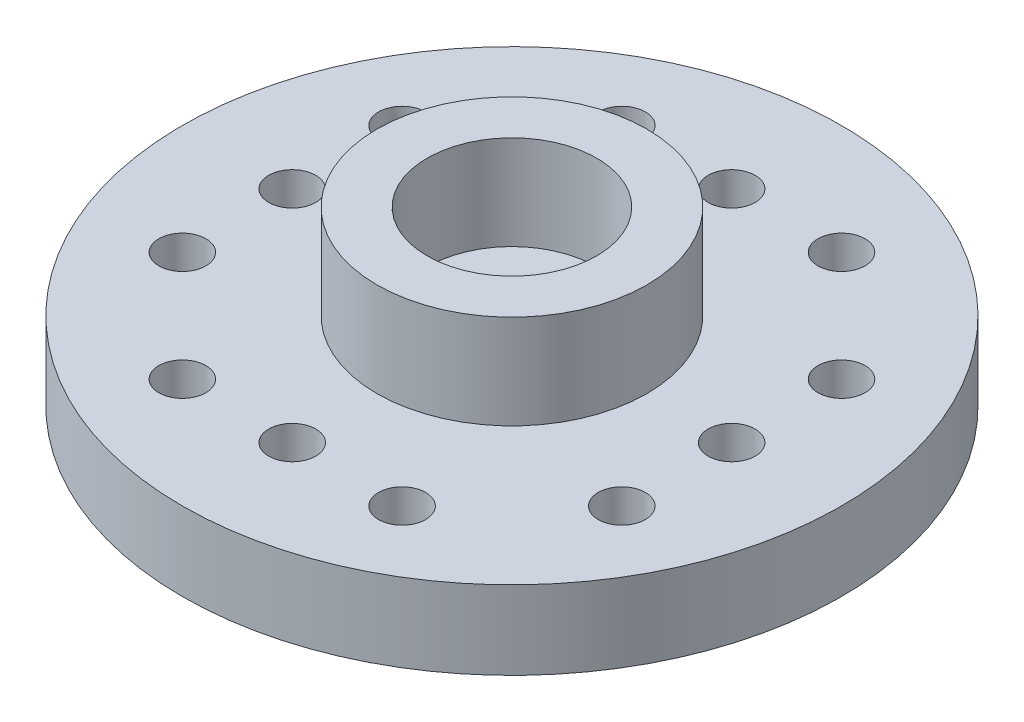
ISO-10303-21;
HEADER;
FILE_DESCRIPTION(('STEP AP214'),'2;1');
FILE_NAME('part.step','',(''),(''),'','','');
FILE_SCHEMA(('AUTOMOTIVE_DESIGN { 1 0 10303 214 1 1 1 1 }'));
ENDSEC;
DATA;
#1=APPLICATION_CONTEXT('core data for automotive mechanical design processes');
#2=APPLICATION_PROTOCOL_DEFINITION('international standard','automotive_design',2000,#1);
#3=PRODUCT_CONTEXT('',#1,'mechanical');
#4=PRODUCT('Part','Part','',(#3));
#5=PRODUCT_RELATED_PRODUCT_CATEGORY('part','',(#4));
#6=PRODUCT_DEFINITION_FORMATION('','',#4);
#7=PRODUCT_DEFINITION_CONTEXT('part definition',#1,'design');
#8=PRODUCT_DEFINITION('design','',#6,#7);
#9=PRODUCT_DEFINITION_SHAPE('','',#8);
#10=(LENGTH_UNIT() NAMED_UNIT(*) SI_UNIT(.MILLI.,.METRE.));
#11=(NAMED_UNIT(*) PLANE_ANGLE_UNIT() SI_UNIT($,.RADIAN.));
#12=(NAMED_UNIT(*) SI_UNIT($,.STERADIAN.) SOLID_ANGLE_UNIT());
#13=UNCERTAINTY_MEASURE_WITH_UNIT(LENGTH_MEASURE(1.E-05),#10,'distance_accuracy_value','');
#14=(GEOMETRIC_REPRESENTATION_CONTEXT(3) GLOBAL_UNCERTAINTY_ASSIGNED_CONTEXT((#13)) GLOBAL_UNIT_ASSIGNED_CONTEXT((#10,
#11,#12)) REPRESENTATION_CONTEXT('',''));
#15=CARTESIAN_POINT('',(0.,0.,0.));
#16=DIRECTION('',(0.,0.,1.));
#17=DIRECTION('',(1.,0.,0.));
#18=AXIS2_PLACEMENT_3D('',#15,#16,#17);
#19=CARTESIAN_POINT('',(0.,2.5,0.));
#20=DIRECTION('',(0.,-1.,0.));
#21=DIRECTION('',(0.,0.,-1.));
#22=AXIS2_PLACEMENT_3D('',#19,#20,#21);
#23=CYLINDRICAL_SURFACE('',#22,1.5);
#24=CARTESIAN_POINT('',(0.,2.5,0.));
#25=DIRECTION('',(0.,1.,0.));
#26=DIRECTION('',(0.,0.,1.));
#27=AXIS2_PLACEMENT_3D('',#24,#25,#26);
#28=CIRCLE('',#27,1.5);
#29=CARTESIAN_POINT('',(0.,2.5,1.5));
#30=VERTEX_POINT('',#29);
#31=EDGE_CURVE('E59',#30,#30,#28,.T.);
#32=ORIENTED_EDGE('',*,*,#31,.T.);
#33=EDGE_LOOP('',(#32));
#34=FACE_BOUND('',#33,.T.);
#35=CARTESIAN_POINT('',(0.,1.,0.));
#36=DIRECTION('',(0.,-1.,0.));
#37=DIRECTION('',(0.,0.,-1.));
#38=AXIS2_PLACEMENT_3D('',#35,#36,#37);
#39=CIRCLE('',#38,1.5);
#40=CARTESIAN_POINT('',(0.,1.,-1.5));
#41=VERTEX_POINT('',#40);
#42=EDGE_CURVE('E148',#41,#41,#39,.F.);
#43=ORIENTED_EDGE('',*,*,#42,.F.);
#44=EDGE_LOOP('',(#43));
#45=FACE_BOUND('',#44,.T.);
#46=ADVANCED_FACE('F43',(#34,#45),#23,.F.);
#47=CARTESIAN_POINT('',(0.,2.5,0.));
#48=DIRECTION('',(0.,1.,0.));
#49=DIRECTION('',(0.,0.,1.));
#50=AXIS2_PLACEMENT_3D('',#47,#48,#49);
#51=PLANE('',#50);
#52=ORIENTED_EDGE('',*,*,#31,.F.);
#53=EDGE_LOOP('',(#52));
#54=FACE_BOUND('',#53,.T.);
#55=CARTESIAN_POINT('',(0.,2.5,0.));
#56=DIRECTION('',(0.,1.,0.));
#57=DIRECTION('',(0.,0.,1.));
#58=AXIS2_PLACEMENT_3D('',#55,#56,#57);
#59=CIRCLE('',#58,2.7);
#60=CARTESIAN_POINT('',(0.,2.5,2.7));
#61=VERTEX_POINT('',#60);
#62=EDGE_CURVE('E11',#61,#61,#59,.F.);
#63=ORIENTED_EDGE('',*,*,#62,.F.);
#64=EDGE_LOOP('',(#63));
#65=FACE_BOUND('',#64,.T.);
#66=ADVANCED_FACE('F223',(#54,#65),#51,.T.);
#67=CARTESIAN_POINT('',(6.99999999999999,2.5,3.50000000000002));
#68=DIRECTION('',(0.,1.,0.));
#69=DIRECTION('',(-1.,0.,0.));
#70=AXIS2_PLACEMENT_3D('',#67,#68,#69);
#71=CIRCLE('',#70,0.749999999999999);
#72=CARTESIAN_POINT('',(6.24999999999999,2.5,3.50000000000002));
#73=VERTEX_POINT('',#72);
#74=EDGE_CURVE('E116',#73,#73,#71,.T.);
#75=ORIENTED_EDGE('',*,*,#74,.F.);
#76=EDGE_LOOP('',(#75));
#77=FACE_BOUND('',#76,.T.);
#78=CARTESIAN_POINT('',(7.00000000000001,2.5,-3.49999999999998));
#79=DIRECTION('',(0.,1.,0.));
#80=DIRECTION('',(-1.,0.,0.));
#81=AXIS2_PLACEMENT_3D('',#78,#79,#80);
#82=CIRCLE('',#81,0.75);
#83=CARTESIAN_POINT('',(6.25000000000001,2.5,-3.49999999999998));
#84=VERTEX_POINT('',#83);
#85=EDGE_CURVE('E110',#84,#84,#82,.T.);
#86=ORIENTED_EDGE('',*,*,#85,.F.);
#87=EDGE_LOOP('',(#86));
#88=FACE_BOUND('',#87,.T.);
#89=CARTESIAN_POINT('',(0.,2.5,7.));
#90=DIRECTION('',(0.,1.,0.));
#91=DIRECTION('',(0.,0.,-1.));
#92=AXIS2_PLACEMENT_3D('',#89,#90,#91);
#93=CIRCLE('',#92,0.75);
#94=CARTESIAN_POINT('',(0.,2.5,6.25));
#95=VERTEX_POINT('',#94);
#96=EDGE_CURVE('E104',#95,#95,#93,.T.);
#97=ORIENTED_EDGE('',*,*,#96,.F.);
#98=EDGE_LOOP('',(#97));
#99=FACE_BOUND('',#98,.T.);
#100=CARTESIAN_POINT('',(-3.5,2.5,7.));
#101=DIRECTION('',(0.,1.,0.));
#102=DIRECTION('',(0.,0.,-1.));
#103=AXIS2_PLACEMENT_3D('',#100,#101,#102);
#104=CIRCLE('',#103,0.749999999999999);
#105=CARTESIAN_POINT('',(-3.5,2.5,6.25));
#106=VERTEX_POINT('',#105);
#107=EDGE_CURVE('E97',#106,#106,#104,.T.);
#108=ORIENTED_EDGE('',*,*,#107,.F.);
#109=EDGE_LOOP('',(#108));
#110=FACE_BOUND('',#109,.T.);
#111=CARTESIAN_POINT('',(-7.00000000000004,2.5,3.49999999999993));
#112=DIRECTION('',(0.,1.,0.));
#113=DIRECTION('',(1.,0.,0.));
#114=AXIS2_PLACEMENT_3D('',#111,#112,#113);
#115=CIRCLE('',#114,0.75);
#116=CARTESIAN_POINT('',(-6.25000000000004,2.5,3.49999999999993));
#117=VERTEX_POINT('',#116);
#118=EDGE_CURVE('E133',#117,#117,#115,.T.);
#119=ORIENTED_EDGE('',*,*,#118,.F.);
#120=EDGE_LOOP('',(#119));
#121=FACE_BOUND('',#120,.T.);
#122=CARTESIAN_POINT('',(-6.99999999999996,2.5,-3.50000000000007));
#123=DIRECTION('',(0.,1.,0.));
#124=DIRECTION('',(1.,0.,0.));
#125=AXIS2_PLACEMENT_3D('',#122,#123,#124);
#126=CIRCLE('',#125,0.749999999999999);
#127=CARTESIAN_POINT('',(-6.24999999999996,2.5,-3.50000000000007));
#128=VERTEX_POINT('',#127);
#129=EDGE_CURVE('E140',#128,#128,#126,.T.);
#130=ORIENTED_EDGE('',*,*,#129,.F.);
#131=EDGE_LOOP('',(#130));
#132=FACE_BOUND('',#131,.T.);
#133=CARTESIAN_POINT('',(-7.,2.5,0.));
#134=DIRECTION('',(0.,1.,0.));
#135=DIRECTION('',(1.,0.,0.));
#136=AXIS2_PLACEMENT_3D('',#133,#134,#135);
#137=CIRCLE('',#136,0.75);
#138=CARTESIAN_POINT('',(-6.25,2.5,0.));
#139=VERTEX_POINT('',#138);
#140=EDGE_CURVE('E121',#139,#139,#137,.T.);
#141=ORIENTED_EDGE('',*,*,#140,.F.);
#142=EDGE_LOOP('',(#141));
#143=FACE_BOUND('',#142,.T.);
#144=CARTESIAN_POINT('',(3.5,2.5,7.));
#145=DIRECTION('',(0.,1.,0.));
#146=DIRECTION('',(0.,0.,-1.));
#147=AXIS2_PLACEMENT_3D('',#144,#145,#146);
#148=CIRCLE('',#147,0.75);
#149=CARTESIAN_POINT('',(3.5,2.5,6.25));
#150=VERTEX_POINT('',#149);
#151=EDGE_CURVE('E128',#150,#150,#148,.T.);
#152=ORIENTED_EDGE('',*,*,#151,.F.);
#153=EDGE_LOOP('',(#152));
#154=FACE_BOUND('',#153,.T.);
#155=CARTESIAN_POINT('',(7.,2.5,0.));
#156=DIRECTION('',(0.,1.,0.));
#157=DIRECTION('',(-1.,0.,0.));
#158=AXIS2_PLACEMENT_3D('',#155,#156,#157);
#159=CIRCLE('',#158,0.75);
#160=CARTESIAN_POINT('',(6.25,2.5,0.));
#161=VERTEX_POINT('',#160);
#162=EDGE_CURVE('E91',#161,#161,#159,.T.);
#163=ORIENTED_EDGE('',*,*,#162,.F.);
#164=EDGE_LOOP('',(#163));
#165=FACE_BOUND('',#164,.T.);
#166=CARTESIAN_POINT('',(-3.5,2.5,-7.));
#167=DIRECTION('',(0.,1.,0.));
#168=DIRECTION('',(0.,0.,1.));
#169=AXIS2_PLACEMENT_3D('',#166,#167,#168);
#170=CIRCLE('',#169,0.75);
#171=CARTESIAN_POINT('',(-3.5,2.5,-6.25));
#172=VERTEX_POINT('',#171);
#173=EDGE_CURVE('E82',#172,#172,#170,.T.);
#174=ORIENTED_EDGE('',*,*,#173,.F.);
#175=EDGE_LOOP('',(#174));
#176=FACE_BOUND('',#175,.T.);
#177=CARTESIAN_POINT('',(3.5,2.5,-7.));
#178=DIRECTION('',(0.,1.,0.));
#179=DIRECTION('',(0.,0.,1.));
#180=AXIS2_PLACEMENT_3D('',#177,#178,#179);
#181=CIRCLE('',#180,0.749999999999999);
#182=CARTESIAN_POINT('',(3.5,2.5,-6.25));
#183=VERTEX_POINT('',#182);
#184=EDGE_CURVE('E76',#183,#183,#181,.T.);
#185=ORIENTED_EDGE('',*,*,#184,.F.);
#186=EDGE_LOOP('',(#185));
#187=FACE_BOUND('',#186,.T.);
#188=CARTESIAN_POINT('',(0.,2.5,-7.));
#189=DIRECTION('',(0.,1.,0.));
#190=DIRECTION('',(0.,0.,1.));
#191=AXIS2_PLACEMENT_3D('',#188,#189,#190);
#192=CIRCLE('',#191,0.75);
#193=CARTESIAN_POINT('',(0.,2.5,-6.25));
#194=VERTEX_POINT('',#193);
#195=EDGE_CURVE('E73',#194,#194,#192,.T.);
#196=ORIENTED_EDGE('',*,*,#195,.F.);
#197=EDGE_LOOP('',(#196));
#198=FACE_BOUND('',#197,.T.);
#199=CARTESIAN_POINT('',(0.,2.5,0.));
#200=DIRECTION('',(0.,1.,0.));
#201=DIRECTION('',(0.,0.,1.));
#202=AXIS2_PLACEMENT_3D('',#199,#200,#201);
#203=CIRCLE('',#202,4.3);
#204=CARTESIAN_POINT('',(0.,2.5,4.3));
#205=VERTEX_POINT('',#204);
#206=EDGE_CURVE('E64',#205,#205,#203,.T.);
#207=ORIENTED_EDGE('',*,*,#206,.F.);
#208=EDGE_LOOP('',(#207));
#209=FACE_BOUND('',#208,.T.);
#210=CARTESIAN_POINT('',(0.,2.5,0.));
#211=DIRECTION('',(0.,1.,0.));
#212=DIRECTION('',(0.,0.,1.));
#213=AXIS2_PLACEMENT_3D('',#210,#211,#212);
#214=CIRCLE('',#213,10.5);
#215=CARTESIAN_POINT('',(0.,2.5,10.5));
#216=VERTEX_POINT('',#215);
#217=EDGE_CURVE('E50',#216,#216,#214,.T.);
#218=ORIENTED_EDGE('',*,*,#217,.T.);
#219=EDGE_LOOP('',(#218));
#220=FACE_BOUND('',#219,.T.);
#221=ADVANCED_FACE('F184',(#77,#88,#99,#110,#121,#132,#143,#154,#165,#176,#187,#198,#209,#220),
#51,.T.);
#222=CARTESIAN_POINT('',(0.,0.,0.));
#223=DIRECTION('',(0.,1.,0.));
#224=DIRECTION('',(0.,0.,1.));
#225=AXIS2_PLACEMENT_3D('',#222,#223,#224);
#226=PLANE('',#225);
#227=CARTESIAN_POINT('',(0.,0.,0.));
#228=DIRECTION('',(0.,-1.,0.));
#229=DIRECTION('',(0.,0.,-1.));
#230=AXIS2_PLACEMENT_3D('',#227,#228,#229);
#231=CIRCLE('',#230,4.3);
#232=CARTESIAN_POINT('',(0.,0.,-4.3));
#233=VERTEX_POINT('',#232);
#234=EDGE_CURVE('E154',#233,#233,#231,.T.);
#235=ORIENTED_EDGE('',*,*,#234,.F.);
#236=EDGE_LOOP('',(#235));
#237=FACE_BOUND('',#236,.T.);
#238=CARTESIAN_POINT('',(6.99999999999999,0.,3.50000000000002));
#239=DIRECTION('',(0.,1.,0.));
#240=DIRECTION('',(-1.,0.,0.));
#241=AXIS2_PLACEMENT_3D('',#238,#239,#240);
#242=CIRCLE('',#241,0.749999999999999);
#243=CARTESIAN_POINT('',(6.24999999999999,0.,3.50000000000002));
#244=VERTEX_POINT('',#243);
#245=EDGE_CURVE('E94',#244,#244,#242,.T.);
#246=ORIENTED_EDGE('',*,*,#245,.T.);
#247=EDGE_LOOP('',(#246));
#248=FACE_BOUND('',#247,.T.);
#249=CARTESIAN_POINT('',(7.00000000000001,0.,-3.49999999999998));
#250=DIRECTION('',(0.,1.,0.));
#251=DIRECTION('',(-1.,0.,0.));
#252=AXIS2_PLACEMENT_3D('',#249,#250,#251);
#253=CIRCLE('',#252,0.75);
#254=CARTESIAN_POINT('',(6.25000000000001,0.,-3.49999999999998));
#255=VERTEX_POINT('',#254);
#256=EDGE_CURVE('E113',#255,#255,#253,.T.);
#257=ORIENTED_EDGE('',*,*,#256,.T.);
#258=EDGE_LOOP('',(#257));
#259=FACE_BOUND('',#258,.T.);
#260=CARTESIAN_POINT('',(0.,0.,7.));
#261=DIRECTION('',(0.,1.,0.));
#262=DIRECTION('',(0.,0.,-1.));
#263=AXIS2_PLACEMENT_3D('',#260,#261,#262);
#264=CIRCLE('',#263,0.75);
#265=CARTESIAN_POINT('',(0.,0.,6.25));
#266=VERTEX_POINT('',#265);
#267=EDGE_CURVE('E107',#266,#266,#264,.T.);
#268=ORIENTED_EDGE('',*,*,#267,.T.);
#269=EDGE_LOOP('',(#268));
#270=FACE_BOUND('',#269,.T.);
#271=CARTESIAN_POINT('',(-3.5,0.,7.));
#272=DIRECTION('',(0.,1.,0.));
#273=DIRECTION('',(0.,0.,-1.));
#274=AXIS2_PLACEMENT_3D('',#271,#272,#273);
#275=CIRCLE('',#274,0.749999999999999);
#276=CARTESIAN_POINT('',(-3.5,0.,6.25));
#277=VERTEX_POINT('',#276);
#278=EDGE_CURVE('E100',#277,#277,#275,.T.);
#279=ORIENTED_EDGE('',*,*,#278,.T.);
#280=EDGE_LOOP('',(#279));
#281=FACE_BOUND('',#280,.T.);
#282=CARTESIAN_POINT('',(-7.00000000000004,0.,3.49999999999993));
#283=DIRECTION('',(0.,1.,0.));
#284=DIRECTION('',(1.,0.,0.));
#285=AXIS2_PLACEMENT_3D('',#282,#283,#284);
#286=CIRCLE('',#285,0.75);
#287=CARTESIAN_POINT('',(-6.25000000000004,0.,3.49999999999993));
#288=VERTEX_POINT('',#287);
#289=EDGE_CURVE('E136',#288,#288,#286,.T.);
#290=ORIENTED_EDGE('',*,*,#289,.T.);
#291=EDGE_LOOP('',(#290));
#292=FACE_BOUND('',#291,.T.);
#293=CARTESIAN_POINT('',(-6.99999999999996,0.,-3.50000000000007));
#294=DIRECTION('',(0.,1.,0.));
#295=DIRECTION('',(1.,0.,0.));
#296=AXIS2_PLACEMENT_3D('',#293,#294,#295);
#297=CIRCLE('',#296,0.749999999999999);
#298=CARTESIAN_POINT('',(-6.24999999999996,0.,-3.50000000000007));
#299=VERTEX_POINT('',#298);
#300=EDGE_CURVE('E125',#299,#299,#297,.T.);
#301=ORIENTED_EDGE('',*,*,#300,.T.);
#302=EDGE_LOOP('',(#301));
#303=FACE_BOUND('',#302,.T.);
#304=CARTESIAN_POINT('',(-7.,0.,0.));
#305=DIRECTION('',(0.,1.,0.));
#306=DIRECTION('',(1.,0.,0.));
#307=AXIS2_PLACEMENT_3D('',#304,#305,#306);
#308=CIRCLE('',#307,0.75);
#309=CARTESIAN_POINT('',(-6.25,0.,0.));
#310=VERTEX_POINT('',#309);
#311=EDGE_CURVE('E124',#310,#310,#308,.T.);
#312=ORIENTED_EDGE('',*,*,#311,.T.);
#313=EDGE_LOOP('',(#312));
#314=FACE_BOUND('',#313,.T.);
#315=CARTESIAN_POINT('',(3.5,0.,7.));
#316=DIRECTION('',(0.,1.,0.));
#317=DIRECTION('',(0.,0.,-1.));
#318=AXIS2_PLACEMENT_3D('',#315,#316,#317);
#319=CIRCLE('',#318,0.75);
#320=CARTESIAN_POINT('',(3.5,0.,6.25));
#321=VERTEX_POINT('',#320);
#322=EDGE_CURVE('E101',#321,#321,#319,.T.);
#323=ORIENTED_EDGE('',*,*,#322,.T.);
#324=EDGE_LOOP('',(#323));
#325=FACE_BOUND('',#324,.T.);
#326=CARTESIAN_POINT('',(7.,0.,0.));
#327=DIRECTION('',(0.,1.,0.));
#328=DIRECTION('',(-1.,0.,0.));
#329=AXIS2_PLACEMENT_3D('',#326,#327,#328);
#330=CIRCLE('',#329,0.75);
#331=CARTESIAN_POINT('',(6.25,0.,0.));
#332=VERTEX_POINT('',#331);
#333=EDGE_CURVE('E83',#332,#332,#330,.T.);
#334=ORIENTED_EDGE('',*,*,#333,.T.);
#335=EDGE_LOOP('',(#334));
#336=FACE_BOUND('',#335,.T.);
#337=CARTESIAN_POINT('',(-3.5,0.,-7.));
#338=DIRECTION('',(0.,1.,0.));
#339=DIRECTION('',(0.,0.,1.));
#340=AXIS2_PLACEMENT_3D('',#337,#338,#339);
#341=CIRCLE('',#340,0.75);
#342=CARTESIAN_POINT('',(-3.5,0.,-6.25));
#343=VERTEX_POINT('',#342);
#344=EDGE_CURVE('E79',#343,#343,#341,.T.);
#345=ORIENTED_EDGE('',*,*,#344,.T.);
#346=EDGE_LOOP('',(#345));
#347=FACE_BOUND('',#346,.T.);
#348=CARTESIAN_POINT('',(3.5,0.,-7.));
#349=DIRECTION('',(0.,1.,0.));
#350=DIRECTION('',(0.,0.,1.));
#351=AXIS2_PLACEMENT_3D('',#348,#349,#350);
#352=CIRCLE('',#351,0.749999999999999);
#353=CARTESIAN_POINT('',(3.5,0.,-6.25));
#354=VERTEX_POINT('',#353);
#355=EDGE_CURVE('E86',#354,#354,#352,.T.);
#356=ORIENTED_EDGE('',*,*,#355,.T.);
#357=EDGE_LOOP('',(#356));
#358=FACE_BOUND('',#357,.T.);
#359=CARTESIAN_POINT('',(0.,0.,-7.));
#360=DIRECTION('',(0.,1.,0.));
#361=DIRECTION('',(0.,0.,1.));
#362=AXIS2_PLACEMENT_3D('',#359,#360,#361);
#363=CIRCLE('',#362,0.75);
#364=CARTESIAN_POINT('',(0.,0.,-6.25));
#365=VERTEX_POINT('',#364);
#366=EDGE_CURVE('E72',#365,#365,#363,.T.);
#367=ORIENTED_EDGE('',*,*,#366,.T.);
#368=EDGE_LOOP('',(#367));
#369=FACE_BOUND('',#368,.T.);
#370=CARTESIAN_POINT('',(0.,0.,0.));
#371=DIRECTION('',(0.,1.,0.));
#372=DIRECTION('',(0.,0.,1.));
#373=AXIS2_PLACEMENT_3D('',#370,#371,#372);
#374=CIRCLE('',#373,10.5);
#375=CARTESIAN_POINT('',(0.,0.,10.5));
#376=VERTEX_POINT('',#375);
#377=EDGE_CURVE('E54',#376,#376,#374,.T.);
#378=ORIENTED_EDGE('',*,*,#377,.F.);
#379=EDGE_LOOP('',(#378));
#380=FACE_BOUND('',#379,.T.);
#381=ADVANCED_FACE('F181',(#237,#248,#259,#270,#281,#292,#303,#314,#325,#336,#347,#358,#369,
#380),#226,.F.);
#382=CARTESIAN_POINT('',(0.,2.5,0.));
#383=DIRECTION('',(0.,-1.,0.));
#384=DIRECTION('',(0.,0.,-1.));
#385=AXIS2_PLACEMENT_3D('',#382,#383,#384);
#386=CYLINDRICAL_SURFACE('',#385,10.5);
#387=ORIENTED_EDGE('',*,*,#217,.F.);
#388=EDGE_LOOP('',(#387));
#389=FACE_BOUND('',#388,.T.);
#390=ORIENTED_EDGE('',*,*,#377,.T.);
#391=EDGE_LOOP('',(#390));
#392=FACE_BOUND('',#391,.T.);
#393=ADVANCED_FACE('F45',(#389,#392),#386,.T.);
#394=CARTESIAN_POINT('',(0.,5.5,0.));
#395=DIRECTION('',(0.,1.,0.));
#396=DIRECTION('',(0.,0.,1.));
#397=AXIS2_PLACEMENT_3D('',#394,#395,#396);
#398=PLANE('',#397);
#399=CARTESIAN_POINT('',(0.,5.5,0.));
#400=DIRECTION('',(0.,1.,0.));
#401=DIRECTION('',(0.,0.,1.));
#402=AXIS2_PLACEMENT_3D('',#399,#400,#401);
#403=CIRCLE('',#402,4.3);
#404=CARTESIAN_POINT('',(0.,5.5,4.3));
#405=VERTEX_POINT('',#404);
#406=EDGE_CURVE('E63',#405,#405,#403,.T.);
#407=ORIENTED_EDGE('',*,*,#406,.T.);
#408=EDGE_LOOP('',(#407));
#409=FACE_BOUND('',#408,.T.);
#410=CARTESIAN_POINT('',(0.,5.5,0.));
#411=DIRECTION('',(0.,1.,0.));
#412=DIRECTION('',(0.,0.,1.));
#413=AXIS2_PLACEMENT_3D('',#410,#411,#412);
#414=CIRCLE('',#413,2.7);
#415=CARTESIAN_POINT('',(0.,5.5,2.7));
#416=VERTEX_POINT('',#415);
#417=EDGE_CURVE('E67',#416,#416,#414,.T.);
#418=ORIENTED_EDGE('',*,*,#417,.F.);
#419=EDGE_LOOP('',(#418));
#420=FACE_BOUND('',#419,.T.);
#421=ADVANCED_FACE('F213',(#409,#420),#398,.T.);
#422=CARTESIAN_POINT('',(0.,5.5,0.));
#423=DIRECTION('',(0.,-1.,0.));
#424=DIRECTION('',(0.,0.,-1.));
#425=AXIS2_PLACEMENT_3D('',#422,#423,#424);
#426=CYLINDRICAL_SURFACE('',#425,4.3);
#427=ORIENTED_EDGE('',*,*,#406,.F.);
#428=EDGE_LOOP('',(#427));
#429=FACE_BOUND('',#428,.T.);
#430=ORIENTED_EDGE('',*,*,#206,.T.);
#431=EDGE_LOOP('',(#430));
#432=FACE_BOUND('',#431,.T.);
#433=ADVANCED_FACE('F219',(#429,#432),#426,.T.);
#434=CARTESIAN_POINT('',(0.,5.5,0.));
#435=DIRECTION('',(0.,-1.,0.));
#436=DIRECTION('',(0.,0.,-1.));
#437=AXIS2_PLACEMENT_3D('',#434,#435,#436);
#438=CYLINDRICAL_SURFACE('',#437,2.7);
#439=ORIENTED_EDGE('',*,*,#417,.T.);
#440=EDGE_LOOP('',(#439));
#441=FACE_BOUND('',#440,.T.);
#442=ORIENTED_EDGE('',*,*,#62,.T.);
#443=EDGE_LOOP('',(#442));
#444=FACE_BOUND('',#443,.T.);
#445=ADVANCED_FACE('F266',(#441,#444),#438,.F.);
#446=CARTESIAN_POINT('',(0.,0.,-7.));
#447=DIRECTION('',(0.,1.,0.));
#448=DIRECTION('',(0.,0.,1.));
#449=AXIS2_PLACEMENT_3D('',#446,#447,#448);
#450=CYLINDRICAL_SURFACE('',#449,0.75);
#451=ORIENTED_EDGE('',*,*,#366,.F.);
#452=EDGE_LOOP('',(#451));
#453=FACE_BOUND('',#452,.T.);
#454=ORIENTED_EDGE('',*,*,#195,.T.);
#455=EDGE_LOOP('',(#454));
#456=FACE_BOUND('',#455,.T.);
#457=ADVANCED_FACE('F271',(#453,#456),#450,.F.);
#458=CARTESIAN_POINT('',(3.5,0.,-7.));
#459=DIRECTION('',(0.,1.,0.));
#460=DIRECTION('',(0.,0.,1.));
#461=AXIS2_PLACEMENT_3D('',#458,#459,#460);
#462=CYLINDRICAL_SURFACE('',#461,0.749999999999999);
#463=ORIENTED_EDGE('',*,*,#355,.F.);
#464=EDGE_LOOP('',(#463));
#465=FACE_BOUND('',#464,.T.);
#466=ORIENTED_EDGE('',*,*,#184,.T.);
#467=EDGE_LOOP('',(#466));
#468=FACE_BOUND('',#467,.T.);
#469=ADVANCED_FACE('F280',(#465,#468),#462,.F.);
#470=CARTESIAN_POINT('',(-3.5,0.,-7.));
#471=DIRECTION('',(0.,1.,0.));
#472=DIRECTION('',(0.,0.,1.));
#473=AXIS2_PLACEMENT_3D('',#470,#471,#472);
#474=CYLINDRICAL_SURFACE('',#473,0.75);
#475=ORIENTED_EDGE('',*,*,#344,.F.);
#476=EDGE_LOOP('',(#475));
#477=FACE_BOUND('',#476,.T.);
#478=ORIENTED_EDGE('',*,*,#173,.T.);
#479=EDGE_LOOP('',(#478));
#480=FACE_BOUND('',#479,.T.);
#481=ADVANCED_FACE('F284',(#477,#480),#474,.F.);
#482=CARTESIAN_POINT('',(7.,0.,0.));
#483=DIRECTION('',(0.,1.,0.));
#484=DIRECTION('',(0.,0.,1.));
#485=AXIS2_PLACEMENT_3D('',#482,#483,#484);
#486=CYLINDRICAL_SURFACE('',#485,0.75);
#487=ORIENTED_EDGE('',*,*,#333,.F.);
#488=EDGE_LOOP('',(#487));
#489=FACE_BOUND('',#488,.T.);
#490=ORIENTED_EDGE('',*,*,#162,.T.);
#491=EDGE_LOOP('',(#490));
#492=FACE_BOUND('',#491,.T.);
#493=ADVANCED_FACE('F286',(#489,#492),#486,.F.);
#494=CARTESIAN_POINT('',(3.5,0.,7.));
#495=DIRECTION('',(0.,1.,0.));
#496=DIRECTION('',(0.,0.,1.));
#497=AXIS2_PLACEMENT_3D('',#494,#495,#496);
#498=CYLINDRICAL_SURFACE('',#497,0.75);
#499=ORIENTED_EDGE('',*,*,#322,.F.);
#500=EDGE_LOOP('',(#499));
#501=FACE_BOUND('',#500,.T.);
#502=ORIENTED_EDGE('',*,*,#151,.T.);
#503=EDGE_LOOP('',(#502));
#504=FACE_BOUND('',#503,.T.);
#505=ADVANCED_FACE('F292',(#501,#504),#498,.F.);
#506=CARTESIAN_POINT('',(-7.,0.,0.));
#507=DIRECTION('',(0.,1.,0.));
#508=DIRECTION('',(0.,0.,1.));
#509=AXIS2_PLACEMENT_3D('',#506,#507,#508);
#510=CYLINDRICAL_SURFACE('',#509,0.75);
#511=ORIENTED_EDGE('',*,*,#311,.F.);
#512=EDGE_LOOP('',(#511));
#513=FACE_BOUND('',#512,.T.);
#514=ORIENTED_EDGE('',*,*,#140,.T.);
#515=EDGE_LOOP('',(#514));
#516=FACE_BOUND('',#515,.T.);
#517=ADVANCED_FACE('F311',(#513,#516),#510,.F.);
#518=CARTESIAN_POINT('',(-6.99999999999996,0.,-3.50000000000007));
#519=DIRECTION('',(0.,1.,0.));
#520=DIRECTION('',(0.,0.,1.));
#521=AXIS2_PLACEMENT_3D('',#518,#519,#520);
#522=CYLINDRICAL_SURFACE('',#521,0.749999999999999);
#523=ORIENTED_EDGE('',*,*,#300,.F.);
#524=EDGE_LOOP('',(#523));
#525=FACE_BOUND('',#524,.T.);
#526=ORIENTED_EDGE('',*,*,#129,.T.);
#527=EDGE_LOOP('',(#526));
#528=FACE_BOUND('',#527,.T.);
#529=ADVANCED_FACE('F314',(#525,#528),#522,.F.);
#530=CARTESIAN_POINT('',(-7.00000000000004,0.,3.49999999999993));
#531=DIRECTION('',(0.,1.,0.));
#532=DIRECTION('',(0.,0.,1.));
#533=AXIS2_PLACEMENT_3D('',#530,#531,#532);
#534=CYLINDRICAL_SURFACE('',#533,0.75);
#535=ORIENTED_EDGE('',*,*,#289,.F.);
#536=EDGE_LOOP('',(#535));
#537=FACE_BOUND('',#536,.T.);
#538=ORIENTED_EDGE('',*,*,#118,.T.);
#539=EDGE_LOOP('',(#538));
#540=FACE_BOUND('',#539,.T.);
#541=ADVANCED_FACE('F298',(#537,#540),#534,.F.);
#542=CARTESIAN_POINT('',(-3.5,0.,7.));
#543=DIRECTION('',(0.,1.,0.));
#544=DIRECTION('',(0.,0.,1.));
#545=AXIS2_PLACEMENT_3D('',#542,#543,#544);
#546=CYLINDRICAL_SURFACE('',#545,0.749999999999999);
#547=ORIENTED_EDGE('',*,*,#278,.F.);
#548=EDGE_LOOP('',(#547));
#549=FACE_BOUND('',#548,.T.);
#550=ORIENTED_EDGE('',*,*,#107,.T.);
#551=EDGE_LOOP('',(#550));
#552=FACE_BOUND('',#551,.T.);
#553=ADVANCED_FACE('F294',(#549,#552),#546,.F.);
#554=CARTESIAN_POINT('',(0.,0.,7.));
#555=DIRECTION('',(0.,1.,0.));
#556=DIRECTION('',(0.,0.,1.));
#557=AXIS2_PLACEMENT_3D('',#554,#555,#556);
#558=CYLINDRICAL_SURFACE('',#557,0.75);
#559=ORIENTED_EDGE('',*,*,#267,.F.);
#560=EDGE_LOOP('',(#559));
#561=FACE_BOUND('',#560,.T.);
#562=ORIENTED_EDGE('',*,*,#96,.T.);
#563=EDGE_LOOP('',(#562));
#564=FACE_BOUND('',#563,.T.);
#565=ADVANCED_FACE('F297',(#561,#564),#558,.F.);
#566=CARTESIAN_POINT('',(7.00000000000001,0.,-3.49999999999998));
#567=DIRECTION('',(0.,1.,0.));
#568=DIRECTION('',(0.,0.,1.));
#569=AXIS2_PLACEMENT_3D('',#566,#567,#568);
#570=CYLINDRICAL_SURFACE('',#569,0.75);
#571=ORIENTED_EDGE('',*,*,#256,.F.);
#572=EDGE_LOOP('',(#571));
#573=FACE_BOUND('',#572,.T.);
#574=ORIENTED_EDGE('',*,*,#85,.T.);
#575=EDGE_LOOP('',(#574));
#576=FACE_BOUND('',#575,.T.);
#577=ADVANCED_FACE('F302',(#573,#576),#570,.F.);
#578=CARTESIAN_POINT('',(6.99999999999999,0.,3.50000000000002));
#579=DIRECTION('',(0.,1.,0.));
#580=DIRECTION('',(0.,0.,1.));
#581=AXIS2_PLACEMENT_3D('',#578,#579,#580);
#582=CYLINDRICAL_SURFACE('',#581,0.749999999999999);
#583=ORIENTED_EDGE('',*,*,#245,.F.);
#584=EDGE_LOOP('',(#583));
#585=FACE_BOUND('',#584,.T.);
#586=ORIENTED_EDGE('',*,*,#74,.T.);
#587=EDGE_LOOP('',(#586));
#588=FACE_BOUND('',#587,.T.);
#589=ADVANCED_FACE('F306',(#585,#588),#582,.F.);
#590=CARTESIAN_POINT('',(0.,1.,0.));
#591=DIRECTION('',(0.,-1.,0.));
#592=DIRECTION('',(0.,0.,-1.));
#593=AXIS2_PLACEMENT_3D('',#590,#591,#592);
#594=CYLINDRICAL_SURFACE('',#593,2.2);
#595=CARTESIAN_POINT('',(0.,1.,0.));
#596=DIRECTION('',(0.,-1.,0.));
#597=DIRECTION('',(0.,0.,-1.));
#598=AXIS2_PLACEMENT_3D('',#595,#596,#597);
#599=CIRCLE('',#598,2.2);
#600=CARTESIAN_POINT('',(0.,1.,-2.2));
#601=VERTEX_POINT('',#600);
#602=EDGE_CURVE('E137',#601,#601,#599,.T.);
#603=ORIENTED_EDGE('',*,*,#602,.F.);
#604=EDGE_LOOP('',(#603));
#605=FACE_BOUND('',#604,.T.);
#606=CARTESIAN_POINT('',(0.,0.,0.));
#607=DIRECTION('',(0.,-1.,0.));
#608=DIRECTION('',(0.,0.,-1.));
#609=AXIS2_PLACEMENT_3D('',#606,#607,#608);
#610=CIRCLE('',#609,2.2);
#611=CARTESIAN_POINT('',(0.,0.,-2.2));
#612=VERTEX_POINT('',#611);
#613=EDGE_CURVE('E145',#612,#612,#610,.T.);
#614=ORIENTED_EDGE('',*,*,#613,.T.);
#615=EDGE_LOOP('',(#614));
#616=FACE_BOUND('',#615,.T.);
#617=ADVANCED_FACE('F309',(#605,#616),#594,.F.);
#618=CARTESIAN_POINT('',(0.,1.,0.));
#619=DIRECTION('',(0.,-1.,0.));
#620=DIRECTION('',(0.,0.,-1.));
#621=AXIS2_PLACEMENT_3D('',#618,#619,#620);
#622=PLANE('',#621);
#623=ORIENTED_EDGE('',*,*,#42,.T.);
#624=EDGE_LOOP('',(#623));
#625=FACE_BOUND('',#624,.T.);
#626=ORIENTED_EDGE('',*,*,#602,.T.);
#627=EDGE_LOOP('',(#626));
#628=FACE_BOUND('',#627,.T.);
#629=ADVANCED_FACE('F327',(#625,#628),#622,.T.);
#630=ORIENTED_EDGE('',*,*,#613,.F.);
#631=EDGE_LOOP('',(#630));
#632=FACE_BOUND('',#631,.T.);
#633=CARTESIAN_POINT('',(0.,0.,0.));
#634=DIRECTION('',(0.,-1.,0.));
#635=DIRECTION('',(0.,0.,-1.));
#636=AXIS2_PLACEMENT_3D('',#633,#634,#635);
#637=CIRCLE('',#636,2.7);
#638=CARTESIAN_POINT('',(0.,0.,-2.7));
#639=VERTEX_POINT('',#638);
#640=EDGE_CURVE('E158',#639,#639,#637,.T.);
#641=ORIENTED_EDGE('',*,*,#640,.T.);
#642=EDGE_LOOP('',(#641));
#643=FACE_BOUND('',#642,.T.);
#644=ADVANCED_FACE('F185',(#632,#643),#226,.F.);
#645=CARTESIAN_POINT('',(0.,1.,0.));
#646=DIRECTION('',(0.,-1.,0.));
#647=DIRECTION('',(0.,0.,-1.));
#648=AXIS2_PLACEMENT_3D('',#645,#646,#647);
#649=CYLINDRICAL_SURFACE('',#648,2.7);
#650=CARTESIAN_POINT('',(0.,1.,0.));
#651=DIRECTION('',(0.,-1.,0.));
#652=DIRECTION('',(0.,0.,-1.));
#653=AXIS2_PLACEMENT_3D('',#650,#651,#652);
#654=CIRCLE('',#653,2.7);
#655=CARTESIAN_POINT('',(0.,1.,-2.7));
#656=VERTEX_POINT('',#655);
#657=EDGE_CURVE('E157',#656,#656,#654,.T.);
#658=ORIENTED_EDGE('',*,*,#657,.T.);
#659=EDGE_LOOP('',(#658));
#660=FACE_BOUND('',#659,.T.);
#661=ORIENTED_EDGE('',*,*,#640,.F.);
#662=EDGE_LOOP('',(#661));
#663=FACE_BOUND('',#662,.T.);
#664=ADVANCED_FACE('F166',(#660,#663),#649,.T.);
#665=CARTESIAN_POINT('',(0.,1.,0.));
#666=DIRECTION('',(0.,-1.,0.));
#667=DIRECTION('',(0.,0.,-1.));
#668=AXIS2_PLACEMENT_3D('',#665,#666,#667);
#669=CYLINDRICAL_SURFACE('',#668,4.3);
#670=CARTESIAN_POINT('',(0.,1.,0.));
#671=DIRECTION('',(0.,-1.,0.));
#672=DIRECTION('',(0.,0.,-1.));
#673=AXIS2_PLACEMENT_3D('',#670,#671,#672);
#674=CIRCLE('',#673,4.3);
#675=CARTESIAN_POINT('',(0.,1.,-4.3));
#676=VERTEX_POINT('',#675);
#677=EDGE_CURVE('E149',#676,#676,#674,.T.);
#678=ORIENTED_EDGE('',*,*,#677,.F.);
#679=EDGE_LOOP('',(#678));
#680=FACE_BOUND('',#679,.T.);
#681=ORIENTED_EDGE('',*,*,#234,.T.);
#682=EDGE_LOOP('',(#681));
#683=FACE_BOUND('',#682,.T.);
#684=ADVANCED_FACE('F172',(#680,#683),#669,.F.);
#685=CARTESIAN_POINT('',(0.,1.,0.));
#686=DIRECTION('',(0.,-1.,0.));
#687=DIRECTION('',(0.,0.,-1.));
#688=AXIS2_PLACEMENT_3D('',#685,#686,#687);
#689=PLANE('',#688);
#690=ORIENTED_EDGE('',*,*,#657,.F.);
#691=EDGE_LOOP('',(#690));
#692=FACE_BOUND('',#691,.T.);
#693=ORIENTED_EDGE('',*,*,#677,.T.);
#694=EDGE_LOOP('',(#693));
#695=FACE_BOUND('',#694,.T.);
#696=ADVANCED_FACE('F169',(#692,#695),#689,.T.);
#697=CLOSED_SHELL('',(#46,#66,#221,#381,#393,#421,#433,#445,#457,#469,#481,#493,#505,#517,#529,
#541,#553,#565,#577,#589,#617,#629,#644,#664,#684,#696));
#698=MANIFOLD_SOLID_BREP('B2',#697);
#699=ADVANCED_BREP_SHAPE_REPRESENTATION('',(#18,#698),#14);
#700=SHAPE_DEFINITION_REPRESENTATION(#9,#699);
ENDSEC;
END-ISO-10303-21;
